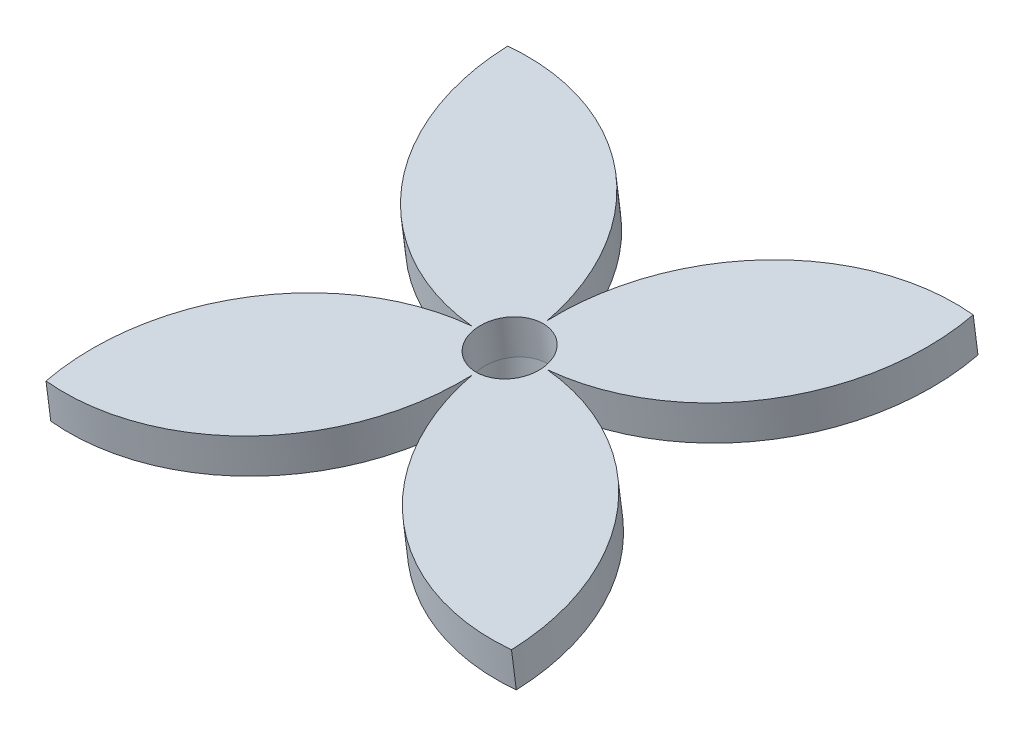
ISO-10303-21;
HEADER;
FILE_DESCRIPTION(('STEP AP214'),'2;1');
FILE_NAME('part.step','',(''),(''),'','','');
FILE_SCHEMA(('AUTOMOTIVE_DESIGN { 1 0 10303 214 1 1 1 1 }'));
ENDSEC;
DATA;
#1=APPLICATION_CONTEXT('core data for automotive mechanical design processes');
#2=APPLICATION_PROTOCOL_DEFINITION('international standard','automotive_design',2000,#1);
#3=PRODUCT_CONTEXT('',#1,'mechanical');
#4=PRODUCT('Part','Part','',(#3));
#5=PRODUCT_RELATED_PRODUCT_CATEGORY('part','',(#4));
#6=PRODUCT_DEFINITION_FORMATION('','',#4);
#7=PRODUCT_DEFINITION_CONTEXT('part definition',#1,'design');
#8=PRODUCT_DEFINITION('design','',#6,#7);
#9=PRODUCT_DEFINITION_SHAPE('','',#8);
#10=(LENGTH_UNIT() NAMED_UNIT(*) SI_UNIT(.MILLI.,.METRE.));
#11=(NAMED_UNIT(*) PLANE_ANGLE_UNIT() SI_UNIT($,.RADIAN.));
#12=(NAMED_UNIT(*) SI_UNIT($,.STERADIAN.) SOLID_ANGLE_UNIT());
#13=UNCERTAINTY_MEASURE_WITH_UNIT(LENGTH_MEASURE(1.E-05),#10,'distance_accuracy_value','');
#14=(GEOMETRIC_REPRESENTATION_CONTEXT(3) GLOBAL_UNCERTAINTY_ASSIGNED_CONTEXT((#13)) GLOBAL_UNIT_ASSIGNED_CONTEXT((#10,
#11,#12)) REPRESENTATION_CONTEXT('',''));
#15=CARTESIAN_POINT('',(0.,0.,0.));
#16=DIRECTION('',(0.,0.,1.));
#17=DIRECTION('',(1.,0.,0.));
#18=AXIS2_PLACEMENT_3D('',#15,#16,#17);
#19=CARTESIAN_POINT('',(0.,5.08,0.));
#20=DIRECTION('',(0.,-1.,0.));
#21=DIRECTION('',(0.,0.,-1.));
#22=AXIS2_PLACEMENT_3D('',#19,#20,#21);
#23=CYLINDRICAL_SURFACE('',#22,1.27);
#24=CARTESIAN_POINT('',(0.,0.,0.));
#25=DIRECTION('',(0.,1.,0.));
#26=DIRECTION('',(0.,0.,1.));
#27=AXIS2_PLACEMENT_3D('',#24,#25,#26);
#28=CIRCLE('',#27,1.27);
#29=CARTESIAN_POINT('',(0.,0.,1.27));
#30=VERTEX_POINT('',#29);
#31=EDGE_CURVE('E13',#30,#30,#28,.T.);
#32=ORIENTED_EDGE('',*,*,#31,.T.);
#33=EDGE_LOOP('',(#32));
#34=FACE_BOUND('',#33,.T.);
#35=CARTESIAN_POINT('',(0.,4.9171965994427,0.));
#36=DIRECTION('',(0.,0.991883350334276,0.127151167236685));
#37=DIRECTION('',(0.,-0.127151167236685,0.991883350334276));
#38=AXIS2_PLACEMENT_3D('',#35,#36,#37);
#39=ELLIPSE('',#38,1.28039249733549,1.27);
#40=CARTESIAN_POINT('',(1.00613961606655E-13,4.75439319888541,1.26999999999993));
#41=VERTEX_POINT('',#40);
#42=CARTESIAN_POINT('',(0.,5.08,-1.27));
#43=VERTEX_POINT('',#42);
#44=EDGE_CURVE('E176',#41,#43,#39,.T.);
#45=ORIENTED_EDGE('',*,*,#44,.F.);
#46=EDGE_CURVE('E59',#43,#41,#39,.T.);
#47=ORIENTED_EDGE('',*,*,#46,.F.);
#48=EDGE_LOOP('',(#45,#47));
#49=FACE_BOUND('',#48,.T.);
#50=ADVANCED_FACE('F44',(#34,#49),#23,.T.);
#51=CARTESIAN_POINT('',(0.,5.08,0.));
#52=DIRECTION('',(0.,-1.,0.));
#53=DIRECTION('',(0.,0.,-1.));
#54=AXIS2_PLACEMENT_3D('',#51,#52,#53);
#55=CYLINDRICAL_SURFACE('',#54,1.143);
#56=CARTESIAN_POINT('',(0.,0.,0.));
#57=DIRECTION('',(0.,1.,0.));
#58=DIRECTION('',(0.,0.,1.));
#59=AXIS2_PLACEMENT_3D('',#56,#57,#58);
#60=CIRCLE('',#59,1.143);
#61=CARTESIAN_POINT('',(0.,0.,1.143));
#62=VERTEX_POINT('',#61);
#63=EDGE_CURVE('E52',#62,#62,#60,.T.);
#64=ORIENTED_EDGE('',*,*,#63,.F.);
#65=EDGE_LOOP('',(#64));
#66=FACE_BOUND('',#65,.T.);
#67=CARTESIAN_POINT('',(0.,4.9171965994427,0.));
#68=DIRECTION('',(0.,-0.991883350334276,-0.127151167236686));
#69=DIRECTION('',(0.,0.127151167236685,-0.991883350334276));
#70=AXIS2_PLACEMENT_3D('',#67,#68,#69);
#71=CIRCLE('',#70,1.143);
#72=CARTESIAN_POINT('',(0.,5.06253038359424,-1.13372266943208));
#73=VERTEX_POINT('',#72);
#74=EDGE_CURVE('E183',#73,#73,#71,.T.);
#75=ORIENTED_EDGE('',*,*,#74,.F.);
#76=EDGE_LOOP('',(#75));
#77=FACE_BOUND('',#76,.T.);
#78=ADVANCED_FACE('F187',(#66,#77),#55,.F.);
#79=CARTESIAN_POINT('',(0.,0.,0.));
#80=DIRECTION('',(0.,1.,0.));
#81=DIRECTION('',(0.,0.,1.));
#82=AXIS2_PLACEMENT_3D('',#79,#80,#81);
#83=PLANE('',#82);
#84=ORIENTED_EDGE('',*,*,#31,.F.);
#85=EDGE_LOOP('',(#84));
#86=FACE_BOUND('',#85,.T.);
#87=ORIENTED_EDGE('',*,*,#63,.T.);
#88=EDGE_LOOP('',(#87));
#89=FACE_BOUND('',#88,.T.);
#90=ADVANCED_FACE('F196',(#86,#89),#83,.F.);
#91=CARTESIAN_POINT('',(-3.93983924748595,5.4181517584854,-3.90786095257446));
#92=DIRECTION('',(0.,0.991883350334276,0.127151167236685));
#93=DIRECTION('',(0.,-0.127151167236685,0.991883350334276));
#94=AXIS2_PLACEMENT_3D('',#91,#92,#93);
#95=PLANE('',#94);
#96=CARTESIAN_POINT('',(-7.23948224630382,4.9985982997213,-0.634999999999585));
#97=DIRECTION('',(0.,0.991883350334276,0.127151167236685));
#98=DIRECTION('',(0.,-0.127151167236685,0.991883350334276));
#99=AXIS2_PLACEMENT_3D('',#96,#97,#98);
#100=CIRCLE('',#99,7.26773378924662);
#101=CARTESIAN_POINT('',(-7.87967849497193,5.91910691752809,-7.81572190514893));
#102=VERTEX_POINT('',#101);
#103=EDGE_CURVE('E143',#43,#102,#100,.T.);
#104=ORIENTED_EDGE('',*,*,#103,.F.);
#105=ORIENTED_EDGE('',*,*,#46,.T.);
#106=CARTESIAN_POINT('',(-7.23948224630375,4.835794899164,0.635000000000398));
#107=DIRECTION('',(0.,0.991883350334276,0.127151167236685));
#108=DIRECTION('',(0.,0.127151167236685,-0.991883350334276));
#109=AXIS2_PLACEMENT_3D('',#106,#107,#108);
#110=CIRCLE('',#109,7.26773378924658);
#111=CARTESIAN_POINT('',(-7.87967849497107,3.9152862813572,7.81572190514978));
#112=VERTEX_POINT('',#111);
#113=EDGE_CURVE('E150',#112,#41,#110,.T.);
#114=ORIENTED_EDGE('',*,*,#113,.F.);
#115=CARTESIAN_POINT('',(-0.640196248667257,3.9966879816359,7.18072190514942));
#116=DIRECTION('',(0.,0.991883350334276,0.127151167236685));
#117=DIRECTION('',(0.,-0.127151167236685,0.991883350334276));
#118=AXIS2_PLACEMENT_3D('',#115,#116,#117);
#119=CIRCLE('',#118,7.26773378924665);
#120=CARTESIAN_POINT('',(-1.28039249733534,4.9171965994427,0.));
#121=VERTEX_POINT('',#120);
#122=EDGE_CURVE('E148',#121,#112,#119,.T.);
#123=ORIENTED_EDGE('',*,*,#122,.F.);
#124=CARTESIAN_POINT('',(-0.640196248668076,5.83770521724949,-7.18072190514934));
#125=DIRECTION('',(0.,0.991883350334276,0.127151167236685));
#126=DIRECTION('',(0.,0.127151167236685,-0.991883350334276));
#127=AXIS2_PLACEMENT_3D('',#124,#125,#126);
#128=CIRCLE('',#127,7.26773378924658);
#129=EDGE_CURVE('E146',#102,#121,#128,.T.);
#130=ORIENTED_EDGE('',*,*,#129,.F.);
#131=EDGE_LOOP('',(#104,#105,#114,#123,#130));
#132=FACE_BOUND('',#131,.T.);
#133=ADVANCED_FACE('F201',(#132),#95,.F.);
#134=CARTESIAN_POINT('',(-3.93983924748595,6.67784361340993,-3.74637897018387));
#135=DIRECTION('',(0.,0.991883350334276,0.127151167236685));
#136=DIRECTION('',(0.,-0.127151167236685,0.991883350334276));
#137=AXIS2_PLACEMENT_3D('',#134,#135,#136);
#138=PLANE('',#137);
#139=CARTESIAN_POINT('',(0.,6.17688845436723,0.161481982390591));
#140=DIRECTION('',(0.,0.991883350334276,0.127151167236685));
#141=DIRECTION('',(0.,-0.127151167236685,0.991883350334276));
#142=AXIS2_PLACEMENT_3D('',#139,#140,#141);
#143=CIRCLE('',#142,1.143);
#144=CARTESIAN_POINT('',(0.,6.0315546702157,1.29520465182267));
#145=VERTEX_POINT('',#144);
#146=EDGE_CURVE('E47',#145,#145,#143,.T.);
#147=ORIENTED_EDGE('',*,*,#146,.F.);
#148=EDGE_LOOP('',(#147));
#149=FACE_BOUND('',#148,.T.);
#150=CARTESIAN_POINT('',(-7.23948224630382,6.25829015464583,-0.473518017608995));
#151=DIRECTION('',(0.,0.991883350334276,0.127151167236685));
#152=DIRECTION('',(0.,-0.127151167236685,0.991883350334276));
#153=AXIS2_PLACEMENT_3D('',#150,#151,#152);
#154=CIRCLE('',#153,7.26773378924662);
#155=CARTESIAN_POINT('',(0.,6.33969185492453,-1.1085180176094));
#156=VERTEX_POINT('',#155);
#157=CARTESIAN_POINT('',(-7.87967849497193,7.17879877245262,-7.65423992275834));
#158=VERTEX_POINT('',#157);
#159=EDGE_CURVE('E160',#156,#158,#154,.T.);
#160=ORIENTED_EDGE('',*,*,#159,.T.);
#161=CARTESIAN_POINT('',(-0.640196248668076,7.09739707217402,-7.01923992275875));
#162=DIRECTION('',(0.,0.991883350334276,0.127151167236685));
#163=DIRECTION('',(0.,0.127151167236685,-0.991883350334276));
#164=AXIS2_PLACEMENT_3D('',#161,#162,#163);
#165=CIRCLE('',#164,7.26773378924658);
#166=CARTESIAN_POINT('',(-1.28039249733534,6.17688845436723,0.161481982390619));
#167=VERTEX_POINT('',#166);
#168=EDGE_CURVE('E106',#158,#167,#165,.T.);
#169=ORIENTED_EDGE('',*,*,#168,.T.);
#170=CARTESIAN_POINT('',(-0.640196248667257,5.25637983656043,7.34220388754001));
#171=DIRECTION('',(0.,0.991883350334276,0.127151167236685));
#172=DIRECTION('',(0.,-0.127151167236685,0.991883350334276));
#173=AXIS2_PLACEMENT_3D('',#170,#171,#172);
#174=CIRCLE('',#173,7.26773378924665);
#175=CARTESIAN_POINT('',(-7.87967849497107,5.17497813628173,7.97720388754037));
#176=VERTEX_POINT('',#175);
#177=EDGE_CURVE('E234',#167,#176,#174,.T.);
#178=ORIENTED_EDGE('',*,*,#177,.T.);
#179=CARTESIAN_POINT('',(-7.23948224630375,6.09548675408853,0.796481982390989));
#180=DIRECTION('',(0.,0.991883350334276,0.127151167236685));
#181=DIRECTION('',(0.,0.127151167236685,-0.991883350334276));
#182=AXIS2_PLACEMENT_3D('',#179,#180,#181);
#183=CIRCLE('',#182,7.26773378924658);
#184=CARTESIAN_POINT('',(1.00613961606655E-13,6.01408505380994,1.43148198239052));
#185=VERTEX_POINT('',#184);
#186=EDGE_CURVE('E243',#176,#185,#183,.T.);
#187=ORIENTED_EDGE('',*,*,#186,.T.);
#188=CARTESIAN_POINT('',(7.23948224630396,6.09548675408863,0.796481982390177));
#189=DIRECTION('',(0.,0.991883350334276,0.127151167236685));
#190=DIRECTION('',(0.,-0.127151167236685,0.991883350334276));
#191=AXIS2_PLACEMENT_3D('',#188,#189,#190);
#192=CIRCLE('',#191,7.26773378924665);
#193=CARTESIAN_POINT('',(7.87967849497208,5.17497813628184,7.97720388753952));
#194=VERTEX_POINT('',#193);
#195=EDGE_CURVE('E125',#185,#194,#192,.T.);
#196=ORIENTED_EDGE('',*,*,#195,.T.);
#197=CARTESIAN_POINT('',(0.64019624866822,5.25637983656044,7.34220388753994));
#198=DIRECTION('',(0.,0.991883350334276,0.127151167236685));
#199=DIRECTION('',(0.,0.127151167236685,-0.991883350334276));
#200=AXIS2_PLACEMENT_3D('',#197,#198,#199);
#201=CIRCLE('',#200,7.26773378924658);
#202=CARTESIAN_POINT('',(1.28039249733549,6.17688845436724,0.161481982390558));
#203=VERTEX_POINT('',#202);
#204=EDGE_CURVE('E119',#194,#203,#201,.T.);
#205=ORIENTED_EDGE('',*,*,#204,.T.);
#206=CARTESIAN_POINT('',(0.640196248667403,7.09739707217403,-7.01923992275882));
#207=DIRECTION('',(0.,0.991883350334276,0.127151167236685));
#208=DIRECTION('',(0.,-0.127151167236685,0.991883350334276));
#209=AXIS2_PLACEMENT_3D('',#206,#207,#208);
#210=CIRCLE('',#209,7.26773378924665);
#211=CARTESIAN_POINT('',(7.87967849497123,7.17879877245274,-7.65423992275923));
#212=VERTEX_POINT('',#211);
#213=EDGE_CURVE('E123',#203,#212,#210,.T.);
#214=ORIENTED_EDGE('',*,*,#213,.T.);
#215=CARTESIAN_POINT('',(7.23948224630389,6.25829015464593,-0.473518017609807));
#216=DIRECTION('',(0.,0.991883350334276,0.127151167236685));
#217=DIRECTION('',(0.,0.127151167236685,-0.991883350334276));
#218=AXIS2_PLACEMENT_3D('',#215,#216,#217);
#219=CIRCLE('',#218,7.26773378924662);
#220=EDGE_CURVE('E68',#212,#156,#219,.T.);
#221=ORIENTED_EDGE('',*,*,#220,.T.);
#222=EDGE_LOOP('',(#160,#169,#178,#187,#196,#205,#214,#221));
#223=FACE_BOUND('',#222,.T.);
#224=ADVANCED_FACE('F121',(#149,#223),#138,.T.);
#225=CARTESIAN_POINT('',(7.23948224630389,6.25829015464593,-0.473518017609807));
#226=DIRECTION('',(0.,-0.991883350334276,-0.127151167236685));
#227=DIRECTION('',(0.,0.127151167236685,-0.991883350334276));
#228=AXIS2_PLACEMENT_3D('',#225,#226,#227);
#229=CYLINDRICAL_SURFACE('',#228,7.26773378924662);
#230=CARTESIAN_POINT('',(7.23948224630389,4.9985982997214,-0.635000000000397));
#231=DIRECTION('',(0.,0.991883350334276,0.127151167236685));
#232=DIRECTION('',(0.,0.127151167236685,-0.991883350334276));
#233=AXIS2_PLACEMENT_3D('',#230,#231,#232);
#234=CIRCLE('',#233,7.26773378924662);
#235=CARTESIAN_POINT('',(7.87967849497123,5.9191069175282,-7.81572190514982));
#236=VERTEX_POINT('',#235);
#237=EDGE_CURVE('E157',#236,#43,#234,.T.);
#238=ORIENTED_EDGE('',*,*,#237,.T.);
#239=DIRECTION('',(0.,-0.991883350334276,-0.127151167236685));
#240=VECTOR('',#239,1.);
#241=CARTESIAN_POINT('',(0.,6.33969185492453,-1.1085180176094));
#242=LINE('',#241,#240);
#243=EDGE_CURVE('E139',#156,#43,#242,.T.);
#244=ORIENTED_EDGE('',*,*,#243,.F.);
#245=ORIENTED_EDGE('',*,*,#220,.F.);
#246=DIRECTION('',(0.,-0.991883350334276,-0.127151167236685));
#247=VECTOR('',#246,1.);
#248=CARTESIAN_POINT('',(7.87967849497123,7.17879877245274,-7.65423992275923));
#249=LINE('',#248,#247);
#250=EDGE_CURVE('E135',#212,#236,#249,.T.);
#251=ORIENTED_EDGE('',*,*,#250,.T.);
#252=EDGE_LOOP('',(#238,#244,#245,#251));
#253=FACE_BOUND('',#252,.T.);
#254=ADVANCED_FACE('F229',(#253),#229,.T.);
#255=CARTESIAN_POINT('',(0.640196248667403,7.09739707217403,-7.01923992275882));
#256=DIRECTION('',(0.,-0.991883350334276,-0.127151167236685));
#257=DIRECTION('',(0.,0.127151167236685,-0.991883350334276));
#258=AXIS2_PLACEMENT_3D('',#255,#256,#257);
#259=CYLINDRICAL_SURFACE('',#258,7.26773378924665);
#260=CARTESIAN_POINT('',(0.640196248667403,5.8377052172495,-7.18072190514942));
#261=DIRECTION('',(0.,0.991883350334276,0.127151167236685));
#262=DIRECTION('',(0.,-0.127151167236685,0.991883350334276));
#263=AXIS2_PLACEMENT_3D('',#260,#261,#262);
#264=CIRCLE('',#263,7.26773378924665);
#265=CARTESIAN_POINT('',(1.28039249733549,4.9171965994427,0.));
#266=VERTEX_POINT('',#265);
#267=EDGE_CURVE('E97',#266,#236,#264,.T.);
#268=ORIENTED_EDGE('',*,*,#267,.T.);
#269=ORIENTED_EDGE('',*,*,#250,.F.);
#270=ORIENTED_EDGE('',*,*,#213,.F.);
#271=DIRECTION('',(0.,-0.991883350334276,-0.127151167236685));
#272=VECTOR('',#271,1.);
#273=CARTESIAN_POINT('',(1.28039249733549,6.17688845436724,0.161481982390558));
#274=LINE('',#273,#272);
#275=EDGE_CURVE('E130',#203,#266,#274,.T.);
#276=ORIENTED_EDGE('',*,*,#275,.T.);
#277=EDGE_LOOP('',(#268,#269,#270,#276));
#278=FACE_BOUND('',#277,.T.);
#279=ADVANCED_FACE('F137',(#278),#259,.T.);
#280=CARTESIAN_POINT('',(0.64019624866822,5.25637983656044,7.34220388753994));
#281=DIRECTION('',(0.,-0.991883350334276,-0.127151167236685));
#282=DIRECTION('',(0.,0.127151167236685,-0.991883350334276));
#283=AXIS2_PLACEMENT_3D('',#280,#281,#282);
#284=CYLINDRICAL_SURFACE('',#283,7.26773378924658);
#285=CARTESIAN_POINT('',(0.64019624866822,3.99668798163591,7.18072190514935));
#286=DIRECTION('',(0.,0.991883350334276,0.127151167236685));
#287=DIRECTION('',(0.,0.127151167236685,-0.991883350334276));
#288=AXIS2_PLACEMENT_3D('',#285,#286,#287);
#289=CIRCLE('',#288,7.26773378924658);
#290=CARTESIAN_POINT('',(7.87967849497208,3.91528628135731,7.81572190514893));
#291=VERTEX_POINT('',#290);
#292=EDGE_CURVE('E133',#291,#266,#289,.T.);
#293=ORIENTED_EDGE('',*,*,#292,.T.);
#294=ORIENTED_EDGE('',*,*,#275,.F.);
#295=ORIENTED_EDGE('',*,*,#204,.F.);
#296=DIRECTION('',(0.,-0.991883350334276,-0.127151167236685));
#297=VECTOR('',#296,1.);
#298=CARTESIAN_POINT('',(7.87967849497208,5.17497813628184,7.97720388753952));
#299=LINE('',#298,#297);
#300=EDGE_CURVE('E134',#194,#291,#299,.T.);
#301=ORIENTED_EDGE('',*,*,#300,.T.);
#302=EDGE_LOOP('',(#293,#294,#295,#301));
#303=FACE_BOUND('',#302,.T.);
#304=ADVANCED_FACE('F131',(#303),#284,.T.);
#305=CARTESIAN_POINT('',(7.23948224630396,6.09548675408863,0.796481982390177));
#306=DIRECTION('',(0.,-0.991883350334276,-0.127151167236685));
#307=DIRECTION('',(0.,0.127151167236685,-0.991883350334276));
#308=AXIS2_PLACEMENT_3D('',#305,#306,#307);
#309=CYLINDRICAL_SURFACE('',#308,7.26773378924665);
#310=CARTESIAN_POINT('',(7.23948224630396,4.8357948991641,0.634999999999587));
#311=DIRECTION('',(0.,0.991883350334276,0.127151167236685));
#312=DIRECTION('',(0.,-0.127151167236685,0.991883350334276));
#313=AXIS2_PLACEMENT_3D('',#310,#311,#312);
#314=CIRCLE('',#313,7.26773378924665);
#315=EDGE_CURVE('E153',#41,#291,#314,.T.);
#316=ORIENTED_EDGE('',*,*,#315,.T.);
#317=ORIENTED_EDGE('',*,*,#300,.F.);
#318=ORIENTED_EDGE('',*,*,#195,.F.);
#319=DIRECTION('',(0.,-0.991883350334276,-0.127151167236685));
#320=VECTOR('',#319,1.);
#321=CARTESIAN_POINT('',(1.00613961606655E-13,6.01408505380994,1.43148198239052));
#322=LINE('',#321,#320);
#323=EDGE_CURVE('E165',#185,#41,#322,.T.);
#324=ORIENTED_EDGE('',*,*,#323,.T.);
#325=EDGE_LOOP('',(#316,#317,#318,#324));
#326=FACE_BOUND('',#325,.T.);
#327=ADVANCED_FACE('F227',(#326),#309,.T.);
#328=CARTESIAN_POINT('',(-7.23948224630375,6.09548675408853,0.796481982390989));
#329=DIRECTION('',(0.,-0.991883350334276,-0.127151167236685));
#330=DIRECTION('',(0.,0.127151167236685,-0.991883350334276));
#331=AXIS2_PLACEMENT_3D('',#328,#329,#330);
#332=CYLINDRICAL_SURFACE('',#331,7.26773378924658);
#333=ORIENTED_EDGE('',*,*,#113,.T.);
#334=ORIENTED_EDGE('',*,*,#323,.F.);
#335=ORIENTED_EDGE('',*,*,#186,.F.);
#336=DIRECTION('',(0.,-0.991883350334276,-0.127151167236685));
#337=VECTOR('',#336,1.);
#338=CARTESIAN_POINT('',(-7.87967849497107,5.17497813628173,7.97720388754037));
#339=LINE('',#338,#337);
#340=EDGE_CURVE('E168',#176,#112,#339,.T.);
#341=ORIENTED_EDGE('',*,*,#340,.T.);
#342=EDGE_LOOP('',(#333,#334,#335,#341));
#343=FACE_BOUND('',#342,.T.);
#344=ADVANCED_FACE('F223',(#343),#332,.T.);
#345=CARTESIAN_POINT('',(-0.640196248667257,5.25637983656043,7.34220388754001));
#346=DIRECTION('',(0.,-0.991883350334276,-0.127151167236685));
#347=DIRECTION('',(0.,0.127151167236685,-0.991883350334276));
#348=AXIS2_PLACEMENT_3D('',#345,#346,#347);
#349=CYLINDRICAL_SURFACE('',#348,7.26773378924665);
#350=ORIENTED_EDGE('',*,*,#122,.T.);
#351=ORIENTED_EDGE('',*,*,#340,.F.);
#352=ORIENTED_EDGE('',*,*,#177,.F.);
#353=DIRECTION('',(0.,-0.991883350334276,-0.127151167236685));
#354=VECTOR('',#353,1.);
#355=CARTESIAN_POINT('',(-1.28039249733534,6.17688845436723,0.161481982390619));
#356=LINE('',#355,#354);
#357=EDGE_CURVE('E171',#167,#121,#356,.T.);
#358=ORIENTED_EDGE('',*,*,#357,.T.);
#359=EDGE_LOOP('',(#350,#351,#352,#358));
#360=FACE_BOUND('',#359,.T.);
#361=ADVANCED_FACE('F246',(#360),#349,.T.);
#362=CARTESIAN_POINT('',(-0.640196248668076,7.09739707217402,-7.01923992275875));
#363=DIRECTION('',(0.,-0.991883350334276,-0.127151167236685));
#364=DIRECTION('',(0.,0.127151167236685,-0.991883350334276));
#365=AXIS2_PLACEMENT_3D('',#362,#363,#364);
#366=CYLINDRICAL_SURFACE('',#365,7.26773378924658);
#367=ORIENTED_EDGE('',*,*,#129,.T.);
#368=ORIENTED_EDGE('',*,*,#357,.F.);
#369=ORIENTED_EDGE('',*,*,#168,.F.);
#370=DIRECTION('',(0.,-0.991883350334276,-0.127151167236685));
#371=VECTOR('',#370,1.);
#372=CARTESIAN_POINT('',(-7.87967849497193,7.17879877245262,-7.65423992275834));
#373=LINE('',#372,#371);
#374=EDGE_CURVE('E174',#158,#102,#373,.T.);
#375=ORIENTED_EDGE('',*,*,#374,.T.);
#376=EDGE_LOOP('',(#367,#368,#369,#375));
#377=FACE_BOUND('',#376,.T.);
#378=ADVANCED_FACE('F247',(#377),#366,.T.);
#379=CARTESIAN_POINT('',(-7.23948224630382,6.25829015464583,-0.473518017608995));
#380=DIRECTION('',(0.,-0.991883350334276,-0.127151167236685));
#381=DIRECTION('',(0.,0.127151167236685,-0.991883350334276));
#382=AXIS2_PLACEMENT_3D('',#379,#380,#381);
#383=CYLINDRICAL_SURFACE('',#382,7.26773378924662);
#384=ORIENTED_EDGE('',*,*,#103,.T.);
#385=ORIENTED_EDGE('',*,*,#374,.F.);
#386=ORIENTED_EDGE('',*,*,#159,.F.);
#387=ORIENTED_EDGE('',*,*,#243,.T.);
#388=EDGE_LOOP('',(#384,#385,#386,#387));
#389=FACE_BOUND('',#388,.T.);
#390=ADVANCED_FACE('F198',(#389),#383,.T.);
#391=ORIENTED_EDGE('',*,*,#315,.F.);
#392=ORIENTED_EDGE('',*,*,#44,.T.);
#393=ORIENTED_EDGE('',*,*,#237,.F.);
#394=ORIENTED_EDGE('',*,*,#267,.F.);
#395=ORIENTED_EDGE('',*,*,#292,.F.);
#396=EDGE_LOOP('',(#391,#392,#393,#394,#395));
#397=FACE_BOUND('',#396,.T.);
#398=ADVANCED_FACE('F208',(#397),#95,.F.);
#399=CARTESIAN_POINT('',(0.,7.43658030929177,0.322963964781182));
#400=DIRECTION('',(0.,-0.991883350334276,-0.127151167236686));
#401=DIRECTION('',(0.,0.127151167236686,-0.991883350334276));
#402=AXIS2_PLACEMENT_3D('',#399,#400,#401);
#403=CYLINDRICAL_SURFACE('',#402,1.143);
#404=ORIENTED_EDGE('',*,*,#146,.T.);
#405=EDGE_LOOP('',(#404));
#406=FACE_BOUND('',#405,.T.);
#407=ORIENTED_EDGE('',*,*,#74,.T.);
#408=EDGE_LOOP('',(#407));
#409=FACE_BOUND('',#408,.T.);
#410=ADVANCED_FACE('F267',(#406,#409),#403,.F.);
#411=CLOSED_SHELL('',(#50,#78,#90,#133,#224,#254,#279,#304,#327,#344,#361,#378,#390,#398,#410));
#412=MANIFOLD_SOLID_BREP('B2',#411);
#413=ADVANCED_BREP_SHAPE_REPRESENTATION('',(#18,#412),#14);
#414=SHAPE_DEFINITION_REPRESENTATION(#9,#413);
ENDSEC;
END-ISO-10303-21;
